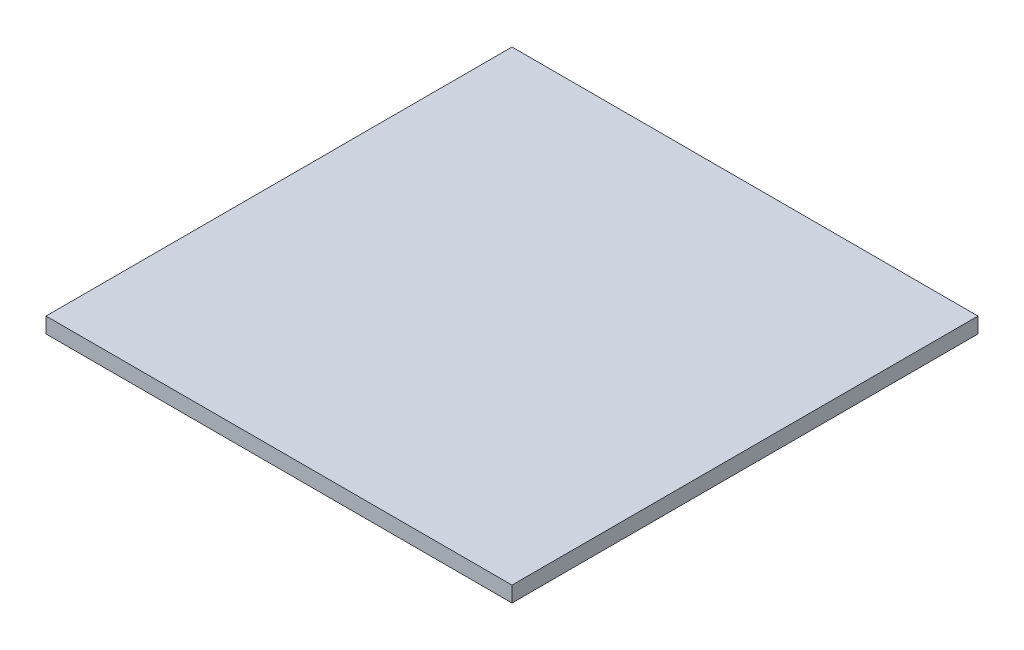
ISO-10303-21;
HEADER;
FILE_DESCRIPTION(('STEP AP214'),'2;1');
FILE_NAME('part.step','',(''),(''),'','','');
FILE_SCHEMA(('AUTOMOTIVE_DESIGN { 1 0 10303 214 1 1 1 1 }'));
ENDSEC;
DATA;
#1=APPLICATION_CONTEXT('core data for automotive mechanical design processes');
#2=APPLICATION_PROTOCOL_DEFINITION('international standard','automotive_design',2000,#1);
#3=PRODUCT_CONTEXT('',#1,'mechanical');
#4=PRODUCT('Part','Part','',(#3));
#5=PRODUCT_RELATED_PRODUCT_CATEGORY('part','',(#4));
#6=PRODUCT_DEFINITION_FORMATION('','',#4);
#7=PRODUCT_DEFINITION_CONTEXT('part definition',#1,'design');
#8=PRODUCT_DEFINITION('design','',#6,#7);
#9=PRODUCT_DEFINITION_SHAPE('','',#8);
#10=(LENGTH_UNIT() NAMED_UNIT(*) SI_UNIT(.MILLI.,.METRE.));
#11=(NAMED_UNIT(*) PLANE_ANGLE_UNIT() SI_UNIT($,.RADIAN.));
#12=(NAMED_UNIT(*) SI_UNIT($,.STERADIAN.) SOLID_ANGLE_UNIT());
#13=UNCERTAINTY_MEASURE_WITH_UNIT(LENGTH_MEASURE(1.E-05),#10,'distance_accuracy_value','');
#14=(GEOMETRIC_REPRESENTATION_CONTEXT(3) GLOBAL_UNCERTAINTY_ASSIGNED_CONTEXT((#13)) GLOBAL_UNIT_ASSIGNED_CONTEXT((#10,
#11,#12)) REPRESENTATION_CONTEXT('',''));
#15=CARTESIAN_POINT('',(0.,0.,0.));
#16=DIRECTION('',(0.,0.,1.));
#17=DIRECTION('',(1.,0.,0.));
#18=AXIS2_PLACEMENT_3D('',#15,#16,#17);
#19=CARTESIAN_POINT('',(1500.,100.,1500.));
#20=DIRECTION('',(-1.,0.,0.));
#21=DIRECTION('',(0.,0.,1.));
#22=AXIS2_PLACEMENT_3D('',#19,#20,#21);
#23=PLANE('',#22);
#24=DIRECTION('',(0.,0.,-1.));
#25=VECTOR('',#24,1.);
#26=CARTESIAN_POINT('',(1500.,0.,1500.));
#27=LINE('',#26,#25);
#28=CARTESIAN_POINT('',(1500.,0.,1500.));
#29=VERTEX_POINT('',#28);
#30=CARTESIAN_POINT('',(1500.,0.,-1500.));
#31=VERTEX_POINT('',#30);
#32=EDGE_CURVE('E96',#29,#31,#27,.T.);
#33=ORIENTED_EDGE('',*,*,#32,.T.);
#34=DIRECTION('',(0.,-1.,0.));
#35=VECTOR('',#34,1.);
#36=CARTESIAN_POINT('',(1500.,100.,-1500.));
#37=LINE('',#36,#35);
#38=CARTESIAN_POINT('',(1500.,100.,-1500.));
#39=VERTEX_POINT('',#38);
#40=EDGE_CURVE('E11',#39,#31,#37,.T.);
#41=ORIENTED_EDGE('',*,*,#40,.F.);
#42=DIRECTION('',(0.,0.,-1.));
#43=VECTOR('',#42,1.);
#44=CARTESIAN_POINT('',(1500.,100.,1500.));
#45=LINE('',#44,#43);
#46=CARTESIAN_POINT('',(1500.,100.,1500.));
#47=VERTEX_POINT('',#46);
#48=EDGE_CURVE('E84',#47,#39,#45,.T.);
#49=ORIENTED_EDGE('',*,*,#48,.F.);
#50=DIRECTION('',(0.,-1.,0.));
#51=VECTOR('',#50,1.);
#52=CARTESIAN_POINT('',(1500.,100.,1500.));
#53=LINE('',#52,#51);
#54=EDGE_CURVE('E92',#47,#29,#53,.T.);
#55=ORIENTED_EDGE('',*,*,#54,.T.);
#56=EDGE_LOOP('',(#33,#41,#49,#55));
#57=FACE_BOUND('',#56,.T.);
#58=ADVANCED_FACE('F33',(#57),#23,.F.);
#59=CARTESIAN_POINT('',(-1500.,100.,-1500.));
#60=DIRECTION('',(0.,0.,1.));
#61=DIRECTION('',(1.,0.,0.));
#62=AXIS2_PLACEMENT_3D('',#59,#60,#61);
#63=PLANE('',#62);
#64=DIRECTION('',(-1.,0.,0.));
#65=VECTOR('',#64,1.);
#66=CARTESIAN_POINT('',(-1500.,0.,-1500.));
#67=LINE('',#66,#65);
#68=CARTESIAN_POINT('',(-1500.,0.,-1500.));
#69=VERTEX_POINT('',#68);
#70=EDGE_CURVE('E88',#31,#69,#67,.T.);
#71=ORIENTED_EDGE('',*,*,#70,.T.);
#72=DIRECTION('',(0.,-1.,0.));
#73=VECTOR('',#72,1.);
#74=CARTESIAN_POINT('',(-1500.,100.,-1500.));
#75=LINE('',#74,#73);
#76=CARTESIAN_POINT('',(-1500.,100.,-1500.));
#77=VERTEX_POINT('',#76);
#78=EDGE_CURVE('E41',#77,#69,#75,.T.);
#79=ORIENTED_EDGE('',*,*,#78,.F.);
#80=DIRECTION('',(-1.,0.,0.));
#81=VECTOR('',#80,1.);
#82=CARTESIAN_POINT('',(-1500.,100.,-1500.));
#83=LINE('',#82,#81);
#84=EDGE_CURVE('E79',#39,#77,#83,.T.);
#85=ORIENTED_EDGE('',*,*,#84,.F.);
#86=ORIENTED_EDGE('',*,*,#40,.T.);
#87=EDGE_LOOP('',(#71,#79,#85,#86));
#88=FACE_BOUND('',#87,.T.);
#89=ADVANCED_FACE('F87',(#88),#63,.F.);
#90=CARTESIAN_POINT('',(-1500.,100.,1500.));
#91=DIRECTION('',(1.,0.,0.));
#92=DIRECTION('',(0.,0.,-1.));
#93=AXIS2_PLACEMENT_3D('',#90,#91,#92);
#94=PLANE('',#93);
#95=DIRECTION('',(0.,0.,1.));
#96=VECTOR('',#95,1.);
#97=CARTESIAN_POINT('',(-1500.,0.,1500.));
#98=LINE('',#97,#96);
#99=CARTESIAN_POINT('',(-1500.,0.,1500.));
#100=VERTEX_POINT('',#99);
#101=EDGE_CURVE('E66',#69,#100,#98,.T.);
#102=ORIENTED_EDGE('',*,*,#101,.T.);
#103=DIRECTION('',(0.,-1.,0.));
#104=VECTOR('',#103,1.);
#105=CARTESIAN_POINT('',(-1500.,100.,1500.));
#106=LINE('',#105,#104);
#107=CARTESIAN_POINT('',(-1500.,100.,1500.));
#108=VERTEX_POINT('',#107);
#109=EDGE_CURVE('E89',#108,#100,#106,.T.);
#110=ORIENTED_EDGE('',*,*,#109,.F.);
#111=DIRECTION('',(0.,0.,1.));
#112=VECTOR('',#111,1.);
#113=CARTESIAN_POINT('',(-1500.,100.,1500.));
#114=LINE('',#113,#112);
#115=EDGE_CURVE('E82',#77,#108,#114,.T.);
#116=ORIENTED_EDGE('',*,*,#115,.F.);
#117=ORIENTED_EDGE('',*,*,#78,.T.);
#118=EDGE_LOOP('',(#102,#110,#116,#117));
#119=FACE_BOUND('',#118,.T.);
#120=ADVANCED_FACE('F90',(#119),#94,.F.);
#121=CARTESIAN_POINT('',(-1500.,100.,1500.));
#122=DIRECTION('',(0.,0.,-1.));
#123=DIRECTION('',(-1.,0.,0.));
#124=AXIS2_PLACEMENT_3D('',#121,#122,#123);
#125=PLANE('',#124);
#126=DIRECTION('',(1.,0.,0.));
#127=VECTOR('',#126,1.);
#128=CARTESIAN_POINT('',(-1500.,0.,1500.));
#129=LINE('',#128,#127);
#130=EDGE_CURVE('E72',#100,#29,#129,.T.);
#131=ORIENTED_EDGE('',*,*,#130,.T.);
#132=ORIENTED_EDGE('',*,*,#54,.F.);
#133=DIRECTION('',(1.,0.,0.));
#134=VECTOR('',#133,1.);
#135=CARTESIAN_POINT('',(-1500.,100.,1500.));
#136=LINE('',#135,#134);
#137=EDGE_CURVE('E49',#108,#47,#136,.T.);
#138=ORIENTED_EDGE('',*,*,#137,.F.);
#139=ORIENTED_EDGE('',*,*,#109,.T.);
#140=EDGE_LOOP('',(#131,#132,#138,#139));
#141=FACE_BOUND('',#140,.T.);
#142=ADVANCED_FACE('F103',(#141),#125,.F.);
#143=CARTESIAN_POINT('',(0.,100.,0.));
#144=DIRECTION('',(0.,-1.,0.));
#145=DIRECTION('',(0.,0.,-1.));
#146=AXIS2_PLACEMENT_3D('',#143,#144,#145);
#147=PLANE('',#146);
#148=ORIENTED_EDGE('',*,*,#48,.T.);
#149=ORIENTED_EDGE('',*,*,#84,.T.);
#150=ORIENTED_EDGE('',*,*,#115,.T.);
#151=ORIENTED_EDGE('',*,*,#137,.T.);
#152=EDGE_LOOP('',(#148,#149,#150,#151));
#153=FACE_BOUND('',#152,.T.);
#154=ADVANCED_FACE('F80',(#153),#147,.F.);
#155=CARTESIAN_POINT('',(0.,0.,0.));
#156=DIRECTION('',(0.,-1.,0.));
#157=DIRECTION('',(0.,0.,-1.));
#158=AXIS2_PLACEMENT_3D('',#155,#156,#157);
#159=PLANE('',#158);
#160=ORIENTED_EDGE('',*,*,#32,.F.);
#161=ORIENTED_EDGE('',*,*,#130,.F.);
#162=ORIENTED_EDGE('',*,*,#101,.F.);
#163=ORIENTED_EDGE('',*,*,#70,.F.);
#164=EDGE_LOOP('',(#160,#161,#162,#163));
#165=FACE_BOUND('',#164,.T.);
#166=ADVANCED_FACE('F106',(#165),#159,.T.);
#167=CLOSED_SHELL('',(#58,#89,#120,#142,#154,#166));
#168=MANIFOLD_SOLID_BREP('B2',#167);
#169=ADVANCED_BREP_SHAPE_REPRESENTATION('',(#18,#168),#14);
#170=SHAPE_DEFINITION_REPRESENTATION(#9,#169);
ENDSEC;
END-ISO-10303-21;
